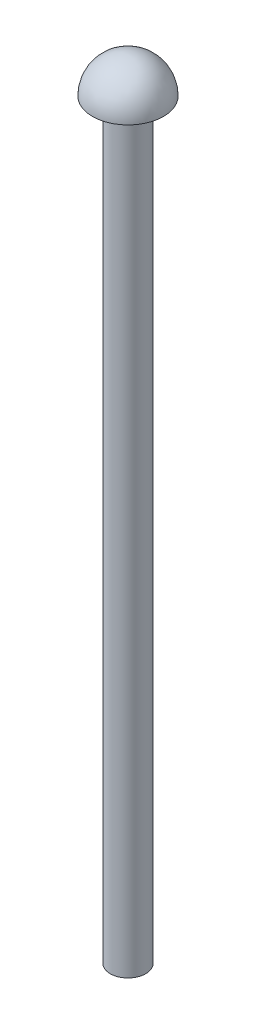
ISO-10303-21;
HEADER;
FILE_DESCRIPTION(('STEP AP214'),'2;1');
FILE_NAME('part.step','',(''),(''),'','','');
FILE_SCHEMA(('AUTOMOTIVE_DESIGN { 1 0 10303 214 1 1 1 1 }'));
ENDSEC;
DATA;
#1=APPLICATION_CONTEXT('core data for automotive mechanical design processes');
#2=APPLICATION_PROTOCOL_DEFINITION('international standard','automotive_design',2000,#1);
#3=PRODUCT_CONTEXT('',#1,'mechanical');
#4=PRODUCT('Part','Part','',(#3));
#5=PRODUCT_RELATED_PRODUCT_CATEGORY('part','',(#4));
#6=PRODUCT_DEFINITION_FORMATION('','',#4);
#7=PRODUCT_DEFINITION_CONTEXT('part definition',#1,'design');
#8=PRODUCT_DEFINITION('design','',#6,#7);
#9=PRODUCT_DEFINITION_SHAPE('','',#8);
#10=(LENGTH_UNIT() NAMED_UNIT(*) SI_UNIT(.MILLI.,.METRE.));
#11=(NAMED_UNIT(*) PLANE_ANGLE_UNIT() SI_UNIT($,.RADIAN.));
#12=(NAMED_UNIT(*) SI_UNIT($,.STERADIAN.) SOLID_ANGLE_UNIT());
#13=UNCERTAINTY_MEASURE_WITH_UNIT(LENGTH_MEASURE(1.E-05),#10,'distance_accuracy_value','');
#14=(GEOMETRIC_REPRESENTATION_CONTEXT(3) GLOBAL_UNCERTAINTY_ASSIGNED_CONTEXT((#13)) GLOBAL_UNIT_ASSIGNED_CONTEXT((#10,
#11,#12)) REPRESENTATION_CONTEXT('',''));
#15=CARTESIAN_POINT('',(0.,0.,0.));
#16=DIRECTION('',(0.,0.,1.));
#17=DIRECTION('',(1.,0.,0.));
#18=AXIS2_PLACEMENT_3D('',#15,#16,#17);
#19=CARTESIAN_POINT('',(0.,63.5,0.));
#20=DIRECTION('',(0.,0.,-1.));
#21=DIRECTION('',(-1.,0.,0.));
#22=AXIS2_PLACEMENT_3D('',#19,#20,#21);
#23=SPHERICAL_SURFACE('',#22,3.);
#24=CARTESIAN_POINT('',(0.,63.5,0.));
#25=DIRECTION('',(0.,-1.,0.));
#26=DIRECTION('',(0.,0.,1.));
#27=AXIS2_PLACEMENT_3D('',#24,#25,#26);
#28=SPHERICAL_SURFACE('',#27,3.);
#29=CARTESIAN_POINT('',(0.,63.5,0.));
#30=DIRECTION('',(0.,-1.,0.));
#31=DIRECTION('',(0.,0.,1.));
#32=AXIS2_PLACEMENT_3D('',#29,#30,#31);
#33=CIRCLE('',#32,3.);
#34=CARTESIAN_POINT('',(0.,63.5,3.));
#35=VERTEX_POINT('',#34);
#36=EDGE_CURVE('E49',#35,#35,#33,.T.);
#37=ORIENTED_EDGE('',*,*,#36,.F.);
#38=EDGE_LOOP('',(#37));
#39=FACE_BOUND('',#38,.T.);
#40=ADVANCED_FACE('F43',(#39),#28,.T.);
#41=CARTESIAN_POINT('',(0.,63.5,0.));
#42=DIRECTION('',(0.,0.,-1.));
#43=DIRECTION('',(-1.,0.,0.));
#44=AXIS2_PLACEMENT_3D('',#41,#42,#43);
#45=SPHERICAL_SURFACE('',#44,1.5);
#46=CARTESIAN_POINT('',(0.,63.5,0.));
#47=DIRECTION('',(0.,-1.,0.));
#48=DIRECTION('',(0.,0.,1.));
#49=AXIS2_PLACEMENT_3D('',#46,#47,#48);
#50=SPHERICAL_SURFACE('',#49,1.5);
#51=CARTESIAN_POINT('',(0.,63.5,0.));
#52=DIRECTION('',(0.,-1.,0.));
#53=DIRECTION('',(0.,0.,1.));
#54=AXIS2_PLACEMENT_3D('',#51,#52,#53);
#55=CIRCLE('',#54,1.5);
#56=CARTESIAN_POINT('',(0.,63.5,1.5));
#57=VERTEX_POINT('',#56);
#58=EDGE_CURVE('E11',#57,#57,#55,.T.);
#59=ORIENTED_EDGE('',*,*,#58,.T.);
#60=EDGE_LOOP('',(#59));
#61=FACE_BOUND('',#60,.T.);
#62=ADVANCED_FACE('F59',(#61),#50,.F.);
#63=CARTESIAN_POINT('',(0.,63.5,0.));
#64=DIRECTION('',(0.,-1.,0.));
#65=DIRECTION('',(0.,0.,1.));
#66=AXIS2_PLACEMENT_3D('',#63,#64,#65);
#67=PLANE('',#66);
#68=ORIENTED_EDGE('',*,*,#36,.T.);
#69=EDGE_LOOP('',(#68));
#70=FACE_BOUND('',#69,.T.);
#71=ORIENTED_EDGE('',*,*,#58,.F.);
#72=EDGE_LOOP('',(#71));
#73=FACE_BOUND('',#72,.T.);
#74=ADVANCED_FACE('F55',(#70,#73),#67,.T.);
#75=CLOSED_SHELL('',(#40,#62,#74));
#76=MANIFOLD_SOLID_BREP('B2',#75);
#77=CARTESIAN_POINT('',(0.,63.5,0.));
#78=DIRECTION('',(0.,-1.,0.));
#79=DIRECTION('',(0.,0.,-1.));
#80=AXIS2_PLACEMENT_3D('',#77,#78,#79);
#81=CYLINDRICAL_SURFACE('',#80,1.5);
#82=CARTESIAN_POINT('',(0.,63.5,0.));
#83=DIRECTION('',(0.,1.,0.));
#84=DIRECTION('',(0.,0.,1.));
#85=AXIS2_PLACEMENT_3D('',#82,#83,#84);
#86=CIRCLE('',#85,1.5);
#87=CARTESIAN_POINT('',(0.,63.5,1.5));
#88=VERTEX_POINT('',#87);
#89=EDGE_CURVE('E42',#88,#88,#86,.T.);
#90=ORIENTED_EDGE('',*,*,#89,.F.);
#91=EDGE_LOOP('',(#90));
#92=FACE_BOUND('',#91,.T.);
#93=CARTESIAN_POINT('',(0.,0.,0.));
#94=DIRECTION('',(0.,1.,0.));
#95=DIRECTION('',(0.,0.,1.));
#96=AXIS2_PLACEMENT_3D('',#93,#94,#95);
#97=CIRCLE('',#96,1.5);
#98=CARTESIAN_POINT('',(0.,0.,1.5));
#99=VERTEX_POINT('',#98);
#100=EDGE_CURVE('E90',#99,#99,#97,.T.);
#101=ORIENTED_EDGE('',*,*,#100,.T.);
#102=EDGE_LOOP('',(#101));
#103=FACE_BOUND('',#102,.T.);
#104=ADVANCED_FACE('F87',(#92,#103),#81,.T.);
#105=CARTESIAN_POINT('',(0.,63.5,0.));
#106=DIRECTION('',(0.,1.,0.));
#107=DIRECTION('',(0.,0.,1.));
#108=AXIS2_PLACEMENT_3D('',#105,#106,#107);
#109=PLANE('',#108);
#110=ORIENTED_EDGE('',*,*,#89,.T.);
#111=EDGE_LOOP('',(#110));
#112=FACE_BOUND('',#111,.T.);
#113=ADVANCED_FACE('F102',(#112),#109,.T.);
#114=CARTESIAN_POINT('',(0.,0.,0.));
#115=DIRECTION('',(0.,1.,0.));
#116=DIRECTION('',(0.,0.,1.));
#117=AXIS2_PLACEMENT_3D('',#114,#115,#116);
#118=PLANE('',#117);
#119=ORIENTED_EDGE('',*,*,#100,.F.);
#120=EDGE_LOOP('',(#119));
#121=FACE_BOUND('',#120,.T.);
#122=ADVANCED_FACE('F100',(#121),#118,.F.);
#123=CLOSED_SHELL('',(#104,#113,#122));
#124=MANIFOLD_SOLID_BREP('B6',#123);
#125=ADVANCED_BREP_SHAPE_REPRESENTATION('',(#18,#76,#124),#14);
#126=SHAPE_DEFINITION_REPRESENTATION(#9,#125);
ENDSEC;
END-ISO-10303-21;
